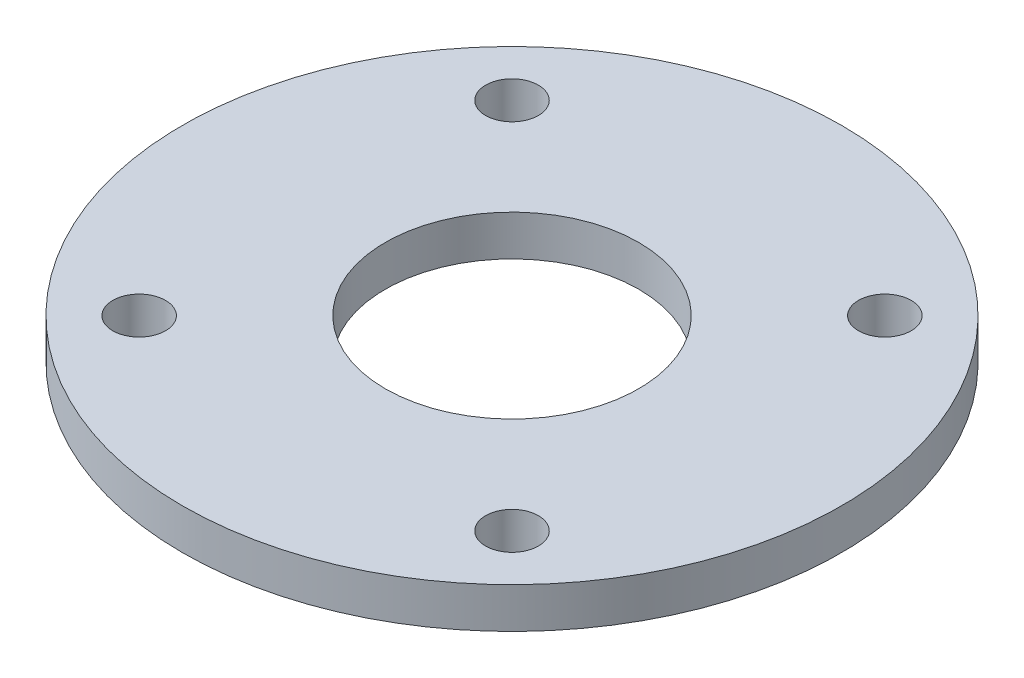
ISO-10303-21;
HEADER;
FILE_DESCRIPTION(('STEP AP214'),'2;1');
FILE_NAME('part.step','',(''),(''),'','','');
FILE_SCHEMA(('AUTOMOTIVE_DESIGN { 1 0 10303 214 1 1 1 1 }'));
ENDSEC;
DATA;
#1=APPLICATION_CONTEXT('core data for automotive mechanical design processes');
#2=APPLICATION_PROTOCOL_DEFINITION('international standard','automotive_design',2000,#1);
#3=PRODUCT_CONTEXT('',#1,'mechanical');
#4=PRODUCT('Part','Part','',(#3));
#5=PRODUCT_RELATED_PRODUCT_CATEGORY('part','',(#4));
#6=PRODUCT_DEFINITION_FORMATION('','',#4);
#7=PRODUCT_DEFINITION_CONTEXT('part definition',#1,'design');
#8=PRODUCT_DEFINITION('design','',#6,#7);
#9=PRODUCT_DEFINITION_SHAPE('','',#8);
#10=(LENGTH_UNIT() NAMED_UNIT(*) SI_UNIT(.MILLI.,.METRE.));
#11=(NAMED_UNIT(*) PLANE_ANGLE_UNIT() SI_UNIT($,.RADIAN.));
#12=(NAMED_UNIT(*) SI_UNIT($,.STERADIAN.) SOLID_ANGLE_UNIT());
#13=UNCERTAINTY_MEASURE_WITH_UNIT(LENGTH_MEASURE(1.E-05),#10,'distance_accuracy_value','');
#14=(GEOMETRIC_REPRESENTATION_CONTEXT(3) GLOBAL_UNCERTAINTY_ASSIGNED_CONTEXT((#13)) GLOBAL_UNIT_ASSIGNED_CONTEXT((#10,
#11,#12)) REPRESENTATION_CONTEXT('',''));
#15=CARTESIAN_POINT('',(0.,0.,0.));
#16=DIRECTION('',(0.,0.,1.));
#17=DIRECTION('',(1.,0.,0.));
#18=AXIS2_PLACEMENT_3D('',#15,#16,#17);
#19=CARTESIAN_POINT('',(0.,4.,0.));
#20=DIRECTION('',(0.,1.,0.));
#21=DIRECTION('',(0.,0.,1.));
#22=AXIS2_PLACEMENT_3D('',#19,#20,#21);
#23=PLANE('',#22);
#24=CARTESIAN_POINT('',(-18.3847763108502,4.,-18.3847763108502));
#25=DIRECTION('',(0.,1.,0.));
#26=DIRECTION('',(0.,0.,1.));
#27=AXIS2_PLACEMENT_3D('',#24,#25,#26);
#28=CIRCLE('',#27,2.6);
#29=CARTESIAN_POINT('',(-18.3847763108502,4.,-15.7847763108502));
#30=VERTEX_POINT('',#29);
#31=EDGE_CURVE('E59',#30,#30,#28,.T.);
#32=ORIENTED_EDGE('',*,*,#31,.F.);
#33=EDGE_LOOP('',(#32));
#34=FACE_BOUND('',#33,.T.);
#35=CARTESIAN_POINT('',(18.3847763108502,4.,18.3847763108502));
#36=DIRECTION('',(0.,1.,0.));
#37=DIRECTION('',(0.,0.,1.));
#38=AXIS2_PLACEMENT_3D('',#35,#36,#37);
#39=CIRCLE('',#38,2.6);
#40=CARTESIAN_POINT('',(18.3847763108502,4.,20.9847763108502));
#41=VERTEX_POINT('',#40);
#42=EDGE_CURVE('E47',#41,#41,#39,.T.);
#43=ORIENTED_EDGE('',*,*,#42,.F.);
#44=EDGE_LOOP('',(#43));
#45=FACE_BOUND('',#44,.T.);
#46=CARTESIAN_POINT('',(0.,4.,0.));
#47=DIRECTION('',(0.,1.,0.));
#48=DIRECTION('',(0.,0.,1.));
#49=AXIS2_PLACEMENT_3D('',#46,#47,#48);
#50=CIRCLE('',#49,32.5);
#51=CARTESIAN_POINT('',(0.,4.,32.5));
#52=VERTEX_POINT('',#51);
#53=EDGE_CURVE('E10',#52,#52,#50,.T.);
#54=ORIENTED_EDGE('',*,*,#53,.T.);
#55=EDGE_LOOP('',(#54));
#56=FACE_BOUND('',#55,.T.);
#57=CARTESIAN_POINT('',(0.,4.,0.));
#58=DIRECTION('',(0.,1.,0.));
#59=DIRECTION('',(0.,0.,1.));
#60=AXIS2_PLACEMENT_3D('',#57,#58,#59);
#61=CIRCLE('',#60,12.5);
#62=CARTESIAN_POINT('',(0.,4.,12.5));
#63=VERTEX_POINT('',#62);
#64=EDGE_CURVE('E42',#63,#63,#61,.T.);
#65=ORIENTED_EDGE('',*,*,#64,.F.);
#66=EDGE_LOOP('',(#65));
#67=FACE_BOUND('',#66,.T.);
#68=CARTESIAN_POINT('',(-18.3847763108502,4.,18.3847763108502));
#69=DIRECTION('',(0.,1.,0.));
#70=DIRECTION('',(0.,0.,1.));
#71=AXIS2_PLACEMENT_3D('',#68,#69,#70);
#72=CIRCLE('',#71,2.6);
#73=CARTESIAN_POINT('',(-18.3847763108502,4.,20.9847763108502));
#74=VERTEX_POINT('',#73);
#75=EDGE_CURVE('E53',#74,#74,#72,.T.);
#76=ORIENTED_EDGE('',*,*,#75,.F.);
#77=EDGE_LOOP('',(#76));
#78=FACE_BOUND('',#77,.T.);
#79=CARTESIAN_POINT('',(18.3847763108502,4.,-18.3847763108502));
#80=DIRECTION('',(0.,1.,0.));
#81=DIRECTION('',(0.,0.,1.));
#82=AXIS2_PLACEMENT_3D('',#79,#80,#81);
#83=CIRCLE('',#82,2.6);
#84=CARTESIAN_POINT('',(18.3847763108502,4.,-15.7847763108502));
#85=VERTEX_POINT('',#84);
#86=EDGE_CURVE('E65',#85,#85,#83,.T.);
#87=ORIENTED_EDGE('',*,*,#86,.F.);
#88=EDGE_LOOP('',(#87));
#89=FACE_BOUND('',#88,.T.);
#90=ADVANCED_FACE('F31',(#34,#45,#56,#67,#78,#89),#23,.T.);
#91=CARTESIAN_POINT('',(0.,0.,0.));
#92=DIRECTION('',(0.,1.,0.));
#93=DIRECTION('',(0.,0.,1.));
#94=AXIS2_PLACEMENT_3D('',#91,#92,#93);
#95=PLANE('',#94);
#96=CARTESIAN_POINT('',(-18.3847763108502,0.,-18.3847763108502));
#97=DIRECTION('',(0.,1.,0.));
#98=DIRECTION('',(0.,0.,1.));
#99=AXIS2_PLACEMENT_3D('',#96,#97,#98);
#100=CIRCLE('',#99,2.6);
#101=CARTESIAN_POINT('',(-18.3847763108502,0.,-15.7847763108502));
#102=VERTEX_POINT('',#101);
#103=EDGE_CURVE('E62',#102,#102,#100,.T.);
#104=ORIENTED_EDGE('',*,*,#103,.T.);
#105=EDGE_LOOP('',(#104));
#106=FACE_BOUND('',#105,.T.);
#107=CARTESIAN_POINT('',(18.3847763108502,0.,18.3847763108502));
#108=DIRECTION('',(0.,1.,0.));
#109=DIRECTION('',(0.,0.,1.));
#110=AXIS2_PLACEMENT_3D('',#107,#108,#109);
#111=CIRCLE('',#110,2.6);
#112=CARTESIAN_POINT('',(18.3847763108502,0.,20.9847763108502));
#113=VERTEX_POINT('',#112);
#114=EDGE_CURVE('E50',#113,#113,#111,.T.);
#115=ORIENTED_EDGE('',*,*,#114,.T.);
#116=EDGE_LOOP('',(#115));
#117=FACE_BOUND('',#116,.T.);
#118=CARTESIAN_POINT('',(0.,0.,0.));
#119=DIRECTION('',(0.,1.,0.));
#120=DIRECTION('',(0.,0.,1.));
#121=AXIS2_PLACEMENT_3D('',#118,#119,#120);
#122=CIRCLE('',#121,32.5);
#123=CARTESIAN_POINT('',(0.,0.,32.5));
#124=VERTEX_POINT('',#123);
#125=EDGE_CURVE('E35',#124,#124,#122,.T.);
#126=ORIENTED_EDGE('',*,*,#125,.F.);
#127=EDGE_LOOP('',(#126));
#128=FACE_BOUND('',#127,.T.);
#129=CARTESIAN_POINT('',(0.,0.,0.));
#130=DIRECTION('',(0.,1.,0.));
#131=DIRECTION('',(0.,0.,1.));
#132=AXIS2_PLACEMENT_3D('',#129,#130,#131);
#133=CIRCLE('',#132,12.5);
#134=CARTESIAN_POINT('',(0.,0.,12.5));
#135=VERTEX_POINT('',#134);
#136=EDGE_CURVE('E44',#135,#135,#133,.T.);
#137=ORIENTED_EDGE('',*,*,#136,.T.);
#138=EDGE_LOOP('',(#137));
#139=FACE_BOUND('',#138,.T.);
#140=CARTESIAN_POINT('',(-18.3847763108502,0.,18.3847763108502));
#141=DIRECTION('',(0.,1.,0.));
#142=DIRECTION('',(0.,0.,1.));
#143=AXIS2_PLACEMENT_3D('',#140,#141,#142);
#144=CIRCLE('',#143,2.6);
#145=CARTESIAN_POINT('',(-18.3847763108502,0.,20.9847763108502));
#146=VERTEX_POINT('',#145);
#147=EDGE_CURVE('E56',#146,#146,#144,.T.);
#148=ORIENTED_EDGE('',*,*,#147,.T.);
#149=EDGE_LOOP('',(#148));
#150=FACE_BOUND('',#149,.T.);
#151=CARTESIAN_POINT('',(18.3847763108502,0.,-18.3847763108502));
#152=DIRECTION('',(0.,1.,0.));
#153=DIRECTION('',(0.,0.,1.));
#154=AXIS2_PLACEMENT_3D('',#151,#152,#153);
#155=CIRCLE('',#154,2.6);
#156=CARTESIAN_POINT('',(18.3847763108502,0.,-15.7847763108502));
#157=VERTEX_POINT('',#156);
#158=EDGE_CURVE('E68',#157,#157,#155,.T.);
#159=ORIENTED_EDGE('',*,*,#158,.T.);
#160=EDGE_LOOP('',(#159));
#161=FACE_BOUND('',#160,.T.);
#162=ADVANCED_FACE('F78',(#106,#117,#128,#139,#150,#161),#95,.F.);
#163=CARTESIAN_POINT('',(0.,4.,0.));
#164=DIRECTION('',(0.,-1.,0.));
#165=DIRECTION('',(0.,0.,-1.));
#166=AXIS2_PLACEMENT_3D('',#163,#164,#165);
#167=CYLINDRICAL_SURFACE('',#166,32.5);
#168=ORIENTED_EDGE('',*,*,#53,.F.);
#169=EDGE_LOOP('',(#168));
#170=FACE_BOUND('',#169,.T.);
#171=ORIENTED_EDGE('',*,*,#125,.T.);
#172=EDGE_LOOP('',(#171));
#173=FACE_BOUND('',#172,.T.);
#174=ADVANCED_FACE('F33',(#170,#173),#167,.T.);
#175=CARTESIAN_POINT('',(0.,4.,0.));
#176=DIRECTION('',(0.,-1.,0.));
#177=DIRECTION('',(0.,0.,-1.));
#178=AXIS2_PLACEMENT_3D('',#175,#176,#177);
#179=CYLINDRICAL_SURFACE('',#178,12.5);
#180=ORIENTED_EDGE('',*,*,#64,.T.);
#181=EDGE_LOOP('',(#180));
#182=FACE_BOUND('',#181,.T.);
#183=ORIENTED_EDGE('',*,*,#136,.F.);
#184=EDGE_LOOP('',(#183));
#185=FACE_BOUND('',#184,.T.);
#186=ADVANCED_FACE('F88',(#182,#185),#179,.F.);
#187=CARTESIAN_POINT('',(18.3847763108502,4.,18.3847763108502));
#188=DIRECTION('',(0.,-1.,0.));
#189=DIRECTION('',(0.,0.,-1.));
#190=AXIS2_PLACEMENT_3D('',#187,#188,#189);
#191=CYLINDRICAL_SURFACE('',#190,2.6);
#192=ORIENTED_EDGE('',*,*,#42,.T.);
#193=EDGE_LOOP('',(#192));
#194=FACE_BOUND('',#193,.T.);
#195=ORIENTED_EDGE('',*,*,#114,.F.);
#196=EDGE_LOOP('',(#195));
#197=FACE_BOUND('',#196,.T.);
#198=ADVANCED_FACE('F91',(#194,#197),#191,.F.);
#199=CARTESIAN_POINT('',(-18.3847763108502,4.,18.3847763108502));
#200=DIRECTION('',(0.,-1.,0.));
#201=DIRECTION('',(0.,0.,-1.));
#202=AXIS2_PLACEMENT_3D('',#199,#200,#201);
#203=CYLINDRICAL_SURFACE('',#202,2.6);
#204=ORIENTED_EDGE('',*,*,#75,.T.);
#205=EDGE_LOOP('',(#204));
#206=FACE_BOUND('',#205,.T.);
#207=ORIENTED_EDGE('',*,*,#147,.F.);
#208=EDGE_LOOP('',(#207));
#209=FACE_BOUND('',#208,.T.);
#210=ADVANCED_FACE('F95',(#206,#209),#203,.F.);
#211=CARTESIAN_POINT('',(-18.3847763108502,4.,-18.3847763108502));
#212=DIRECTION('',(0.,-1.,0.));
#213=DIRECTION('',(0.,0.,-1.));
#214=AXIS2_PLACEMENT_3D('',#211,#212,#213);
#215=CYLINDRICAL_SURFACE('',#214,2.6);
#216=ORIENTED_EDGE('',*,*,#31,.T.);
#217=EDGE_LOOP('',(#216));
#218=FACE_BOUND('',#217,.T.);
#219=ORIENTED_EDGE('',*,*,#103,.F.);
#220=EDGE_LOOP('',(#219));
#221=FACE_BOUND('',#220,.T.);
#222=ADVANCED_FACE('F99',(#218,#221),#215,.F.);
#223=CARTESIAN_POINT('',(18.3847763108502,4.,-18.3847763108502));
#224=DIRECTION('',(0.,-1.,0.));
#225=DIRECTION('',(0.,0.,-1.));
#226=AXIS2_PLACEMENT_3D('',#223,#224,#225);
#227=CYLINDRICAL_SURFACE('',#226,2.6);
#228=ORIENTED_EDGE('',*,*,#86,.T.);
#229=EDGE_LOOP('',(#228));
#230=FACE_BOUND('',#229,.T.);
#231=ORIENTED_EDGE('',*,*,#158,.F.);
#232=EDGE_LOOP('',(#231));
#233=FACE_BOUND('',#232,.T.);
#234=ADVANCED_FACE('F74',(#230,#233),#227,.F.);
#235=CLOSED_SHELL('',(#90,#162,#174,#186,#198,#210,#222,#234));
#236=MANIFOLD_SOLID_BREP('B2',#235);
#237=ADVANCED_BREP_SHAPE_REPRESENTATION('',(#18,#236),#14);
#238=SHAPE_DEFINITION_REPRESENTATION(#9,#237);
ENDSEC;
END-ISO-10303-21;
